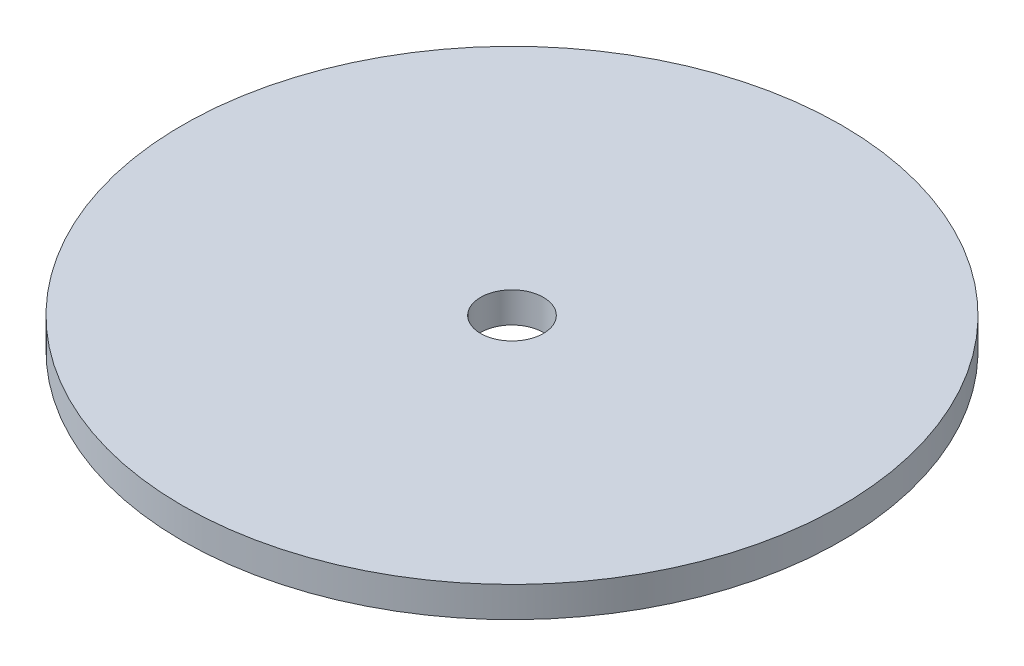
ISO-10303-21;
HEADER;
FILE_DESCRIPTION(('STEP AP214'),'2;1');
FILE_NAME('part.step','',(''),(''),'','','');
FILE_SCHEMA(('AUTOMOTIVE_DESIGN { 1 0 10303 214 1 1 1 1 }'));
ENDSEC;
DATA;
#1=APPLICATION_CONTEXT('core data for automotive mechanical design processes');
#2=APPLICATION_PROTOCOL_DEFINITION('international standard','automotive_design',2000,#1);
#3=PRODUCT_CONTEXT('',#1,'mechanical');
#4=PRODUCT('Part','Part','',(#3));
#5=PRODUCT_RELATED_PRODUCT_CATEGORY('part','',(#4));
#6=PRODUCT_DEFINITION_FORMATION('','',#4);
#7=PRODUCT_DEFINITION_CONTEXT('part definition',#1,'design');
#8=PRODUCT_DEFINITION('design','',#6,#7);
#9=PRODUCT_DEFINITION_SHAPE('','',#8);
#10=(LENGTH_UNIT() NAMED_UNIT(*) SI_UNIT(.MILLI.,.METRE.));
#11=(NAMED_UNIT(*) PLANE_ANGLE_UNIT() SI_UNIT($,.RADIAN.));
#12=(NAMED_UNIT(*) SI_UNIT($,.STERADIAN.) SOLID_ANGLE_UNIT());
#13=UNCERTAINTY_MEASURE_WITH_UNIT(LENGTH_MEASURE(1.E-05),#10,'distance_accuracy_value','');
#14=(GEOMETRIC_REPRESENTATION_CONTEXT(3) GLOBAL_UNCERTAINTY_ASSIGNED_CONTEXT((#13)) GLOBAL_UNIT_ASSIGNED_CONTEXT((#10,
#11,#12)) REPRESENTATION_CONTEXT('',''));
#15=CARTESIAN_POINT('',(0.,0.,0.));
#16=DIRECTION('',(0.,0.,1.));
#17=DIRECTION('',(1.,0.,0.));
#18=AXIS2_PLACEMENT_3D('',#15,#16,#17);
#19=CARTESIAN_POINT('',(0.,3.175,0.));
#20=DIRECTION('',(0.,-1.,0.));
#21=DIRECTION('',(0.,0.,-1.));
#22=AXIS2_PLACEMENT_3D('',#19,#20,#21);
#23=CYLINDRICAL_SURFACE('',#22,34.29);
#24=CARTESIAN_POINT('',(0.,3.175,0.));
#25=DIRECTION('',(0.,1.,0.));
#26=DIRECTION('',(0.,0.,1.));
#27=AXIS2_PLACEMENT_3D('',#24,#25,#26);
#28=CIRCLE('',#27,34.29);
#29=CARTESIAN_POINT('',(0.,3.175,34.29));
#30=VERTEX_POINT('',#29);
#31=EDGE_CURVE('E10',#30,#30,#28,.T.);
#32=ORIENTED_EDGE('',*,*,#31,.F.);
#33=EDGE_LOOP('',(#32));
#34=FACE_BOUND('',#33,.T.);
#35=CARTESIAN_POINT('',(0.,0.,0.));
#36=DIRECTION('',(0.,1.,0.));
#37=DIRECTION('',(0.,0.,1.));
#38=AXIS2_PLACEMENT_3D('',#35,#36,#37);
#39=CIRCLE('',#38,34.29);
#40=CARTESIAN_POINT('',(0.,0.,34.29));
#41=VERTEX_POINT('',#40);
#42=EDGE_CURVE('E44',#41,#41,#39,.T.);
#43=ORIENTED_EDGE('',*,*,#42,.T.);
#44=EDGE_LOOP('',(#43));
#45=FACE_BOUND('',#44,.T.);
#46=ADVANCED_FACE('F41',(#34,#45),#23,.T.);
#47=CARTESIAN_POINT('',(0.,3.175,0.));
#48=DIRECTION('',(0.,1.,0.));
#49=DIRECTION('',(0.,0.,1.));
#50=AXIS2_PLACEMENT_3D('',#47,#48,#49);
#51=PLANE('',#50);
#52=CARTESIAN_POINT('',(0.,3.175,0.));
#53=DIRECTION('',(0.,1.,0.));
#54=DIRECTION('',(0.,0.,1.));
#55=AXIS2_PLACEMENT_3D('',#52,#53,#54);
#56=CIRCLE('',#55,3.2639);
#57=CARTESIAN_POINT('',(0.,3.175,3.2639));
#58=VERTEX_POINT('',#57);
#59=EDGE_CURVE('E58',#58,#58,#56,.T.);
#60=ORIENTED_EDGE('',*,*,#59,.F.);
#61=EDGE_LOOP('',(#60));
#62=FACE_BOUND('',#61,.T.);
#63=ORIENTED_EDGE('',*,*,#31,.T.);
#64=EDGE_LOOP('',(#63));
#65=FACE_BOUND('',#64,.T.);
#66=ADVANCED_FACE('F65',(#62,#65),#51,.T.);
#67=CARTESIAN_POINT('',(0.,0.,0.));
#68=DIRECTION('',(0.,1.,0.));
#69=DIRECTION('',(0.,0.,1.));
#70=AXIS2_PLACEMENT_3D('',#67,#68,#69);
#71=PLANE('',#70);
#72=CARTESIAN_POINT('',(0.,0.,0.));
#73=DIRECTION('',(0.,1.,0.));
#74=DIRECTION('',(0.,0.,1.));
#75=AXIS2_PLACEMENT_3D('',#72,#73,#74);
#76=CIRCLE('',#75,3.2639);
#77=CARTESIAN_POINT('',(0.,0.,3.2639));
#78=VERTEX_POINT('',#77);
#79=EDGE_CURVE('E53',#78,#78,#76,.T.);
#80=ORIENTED_EDGE('',*,*,#79,.T.);
#81=EDGE_LOOP('',(#80));
#82=FACE_BOUND('',#81,.T.);
#83=ORIENTED_EDGE('',*,*,#42,.F.);
#84=EDGE_LOOP('',(#83));
#85=FACE_BOUND('',#84,.T.);
#86=ADVANCED_FACE('F67',(#82,#85),#71,.F.);
#87=CARTESIAN_POINT('',(0.,3.175,0.));
#88=DIRECTION('',(0.,1.,0.));
#89=DIRECTION('',(0.,0.,1.));
#90=AXIS2_PLACEMENT_3D('',#87,#88,#89);
#91=CYLINDRICAL_SURFACE('',#90,3.2639);
#92=ORIENTED_EDGE('',*,*,#79,.F.);
#93=EDGE_LOOP('',(#92));
#94=FACE_BOUND('',#93,.T.);
#95=ORIENTED_EDGE('',*,*,#59,.T.);
#96=EDGE_LOOP('',(#95));
#97=FACE_BOUND('',#96,.T.);
#98=ADVANCED_FACE('F63',(#94,#97),#91,.F.);
#99=CLOSED_SHELL('',(#46,#66,#86,#98));
#100=MANIFOLD_SOLID_BREP('B2',#99);
#101=ADVANCED_BREP_SHAPE_REPRESENTATION('',(#18,#100),#14);
#102=SHAPE_DEFINITION_REPRESENTATION(#9,#101);
ENDSEC;
END-ISO-10303-21;
